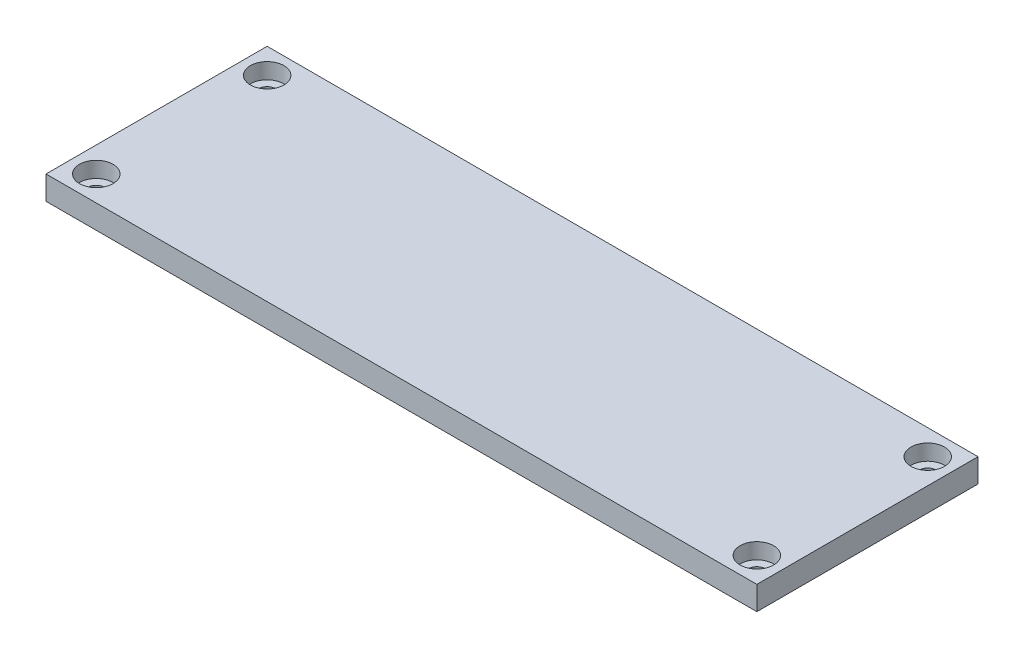
ISO-10303-21;
HEADER;
FILE_DESCRIPTION(('STEP AP214'),'2;1');
FILE_NAME('part.step','',(''),(''),'','','');
FILE_SCHEMA(('AUTOMOTIVE_DESIGN { 1 0 10303 214 1 1 1 1 }'));
ENDSEC;
DATA;
#1=APPLICATION_CONTEXT('core data for automotive mechanical design processes');
#2=APPLICATION_PROTOCOL_DEFINITION('international standard','automotive_design',2000,#1);
#3=PRODUCT_CONTEXT('',#1,'mechanical');
#4=PRODUCT('Part','Part','',(#3));
#5=PRODUCT_RELATED_PRODUCT_CATEGORY('part','',(#4));
#6=PRODUCT_DEFINITION_FORMATION('','',#4);
#7=PRODUCT_DEFINITION_CONTEXT('part definition',#1,'design');
#8=PRODUCT_DEFINITION('design','',#6,#7);
#9=PRODUCT_DEFINITION_SHAPE('','',#8);
#10=(LENGTH_UNIT() NAMED_UNIT(*) SI_UNIT(.MILLI.,.METRE.));
#11=(NAMED_UNIT(*) PLANE_ANGLE_UNIT() SI_UNIT($,.RADIAN.));
#12=(NAMED_UNIT(*) SI_UNIT($,.STERADIAN.) SOLID_ANGLE_UNIT());
#13=UNCERTAINTY_MEASURE_WITH_UNIT(LENGTH_MEASURE(1.E-05),#10,'distance_accuracy_value','');
#14=(GEOMETRIC_REPRESENTATION_CONTEXT(3) GLOBAL_UNCERTAINTY_ASSIGNED_CONTEXT((#13)) GLOBAL_UNIT_ASSIGNED_CONTEXT((#10,
#11,#12)) REPRESENTATION_CONTEXT('',''));
#15=CARTESIAN_POINT('',(0.,0.,0.));
#16=DIRECTION('',(0.,0.,1.));
#17=DIRECTION('',(1.,0.,0.));
#18=AXIS2_PLACEMENT_3D('',#15,#16,#17);
#19=CARTESIAN_POINT('',(-34.7741935483871,3.,8.01612903225806));
#20=DIRECTION('',(1.,0.,0.));
#21=DIRECTION('',(0.,0.,-1.));
#22=AXIS2_PLACEMENT_3D('',#19,#20,#21);
#23=PLANE('',#22);
#24=DIRECTION('',(0.,0.,1.));
#25=VECTOR('',#24,1.);
#26=CARTESIAN_POINT('',(-34.7741935483871,0.,8.01612903225806));
#27=LINE('',#26,#25);
#28=CARTESIAN_POINT('',(-34.7741935483871,0.,-19.9838709677419));
#29=VERTEX_POINT('',#28);
#30=CARTESIAN_POINT('',(-34.7741935483871,0.,8.01612903225806));
#31=VERTEX_POINT('',#30);
#32=EDGE_CURVE('E107',#29,#31,#27,.T.);
#33=ORIENTED_EDGE('',*,*,#32,.T.);
#34=DIRECTION('',(0.,-1.,0.));
#35=VECTOR('',#34,1.);
#36=CARTESIAN_POINT('',(-34.7741935483871,3.,8.01612903225806));
#37=LINE('',#36,#35);
#38=CARTESIAN_POINT('',(-34.7741935483871,3.,8.01612903225806));
#39=VERTEX_POINT('',#38);
#40=EDGE_CURVE('E11',#39,#31,#37,.T.);
#41=ORIENTED_EDGE('',*,*,#40,.F.);
#42=DIRECTION('',(0.,0.,1.));
#43=VECTOR('',#42,1.);
#44=CARTESIAN_POINT('',(-34.7741935483871,3.,8.01612903225806));
#45=LINE('',#44,#43);
#46=CARTESIAN_POINT('',(-34.7741935483871,3.,-19.9838709677419));
#47=VERTEX_POINT('',#46);
#48=EDGE_CURVE('E91',#47,#39,#45,.T.);
#49=ORIENTED_EDGE('',*,*,#48,.F.);
#50=DIRECTION('',(0.,-1.,0.));
#51=VECTOR('',#50,1.);
#52=CARTESIAN_POINT('',(-34.7741935483871,3.,-19.9838709677419));
#53=LINE('',#52,#51);
#54=EDGE_CURVE('E103',#47,#29,#53,.T.);
#55=ORIENTED_EDGE('',*,*,#54,.T.);
#56=EDGE_LOOP('',(#33,#41,#49,#55));
#57=FACE_BOUND('',#56,.T.);
#58=ADVANCED_FACE('F39',(#57),#23,.F.);
#59=CARTESIAN_POINT('',(-34.7741935483871,3.,8.01612903225806));
#60=DIRECTION('',(0.,0.,-1.));
#61=DIRECTION('',(-1.,0.,0.));
#62=AXIS2_PLACEMENT_3D('',#59,#60,#61);
#63=PLANE('',#62);
#64=DIRECTION('',(1.,0.,0.));
#65=VECTOR('',#64,1.);
#66=CARTESIAN_POINT('',(-34.7741935483871,0.,8.01612903225806));
#67=LINE('',#66,#65);
#68=CARTESIAN_POINT('',(55.2258064516129,0.,8.01612903225806));
#69=VERTEX_POINT('',#68);
#70=EDGE_CURVE('E96',#31,#69,#67,.T.);
#71=ORIENTED_EDGE('',*,*,#70,.T.);
#72=DIRECTION('',(0.,-1.,0.));
#73=VECTOR('',#72,1.);
#74=CARTESIAN_POINT('',(55.2258064516129,3.,8.01612903225806));
#75=LINE('',#74,#73);
#76=CARTESIAN_POINT('',(55.2258064516129,3.,8.01612903225806));
#77=VERTEX_POINT('',#76);
#78=EDGE_CURVE('E48',#77,#69,#75,.T.);
#79=ORIENTED_EDGE('',*,*,#78,.F.);
#80=DIRECTION('',(1.,0.,0.));
#81=VECTOR('',#80,1.);
#82=CARTESIAN_POINT('',(-34.7741935483871,3.,8.01612903225806));
#83=LINE('',#82,#81);
#84=EDGE_CURVE('E86',#39,#77,#83,.T.);
#85=ORIENTED_EDGE('',*,*,#84,.F.);
#86=ORIENTED_EDGE('',*,*,#40,.T.);
#87=EDGE_LOOP('',(#71,#79,#85,#86));
#88=FACE_BOUND('',#87,.T.);
#89=ADVANCED_FACE('F95',(#88),#63,.F.);
#90=CARTESIAN_POINT('',(55.2258064516129,3.,8.01612903225806));
#91=DIRECTION('',(-1.,0.,0.));
#92=DIRECTION('',(0.,0.,1.));
#93=AXIS2_PLACEMENT_3D('',#90,#91,#92);
#94=PLANE('',#93);
#95=DIRECTION('',(0.,0.,-1.));
#96=VECTOR('',#95,1.);
#97=CARTESIAN_POINT('',(55.2258064516129,0.,8.01612903225806));
#98=LINE('',#97,#96);
#99=CARTESIAN_POINT('',(55.2258064516129,0.,-19.9838709677419));
#100=VERTEX_POINT('',#99);
#101=EDGE_CURVE('E73',#69,#100,#98,.T.);
#102=ORIENTED_EDGE('',*,*,#101,.T.);
#103=DIRECTION('',(0.,-1.,0.));
#104=VECTOR('',#103,1.);
#105=CARTESIAN_POINT('',(55.2258064516129,3.,-19.9838709677419));
#106=LINE('',#105,#104);
#107=CARTESIAN_POINT('',(55.2258064516129,3.,-19.9838709677419));
#108=VERTEX_POINT('',#107);
#109=EDGE_CURVE('E98',#108,#100,#106,.T.);
#110=ORIENTED_EDGE('',*,*,#109,.F.);
#111=DIRECTION('',(0.,0.,-1.));
#112=VECTOR('',#111,1.);
#113=CARTESIAN_POINT('',(55.2258064516129,3.,8.01612903225806));
#114=LINE('',#113,#112);
#115=EDGE_CURVE('E89',#77,#108,#114,.T.);
#116=ORIENTED_EDGE('',*,*,#115,.F.);
#117=ORIENTED_EDGE('',*,*,#78,.T.);
#118=EDGE_LOOP('',(#102,#110,#116,#117));
#119=FACE_BOUND('',#118,.T.);
#120=ADVANCED_FACE('F99',(#119),#94,.F.);
#121=CARTESIAN_POINT('',(-34.7741935483871,3.,-19.9838709677419));
#122=DIRECTION('',(0.,0.,1.));
#123=DIRECTION('',(1.,0.,0.));
#124=AXIS2_PLACEMENT_3D('',#121,#122,#123);
#125=PLANE('',#124);
#126=DIRECTION('',(-1.,0.,0.));
#127=VECTOR('',#126,1.);
#128=CARTESIAN_POINT('',(-34.7741935483871,0.,-19.9838709677419));
#129=LINE('',#128,#127);
#130=EDGE_CURVE('E79',#100,#29,#129,.T.);
#131=ORIENTED_EDGE('',*,*,#130,.T.);
#132=ORIENTED_EDGE('',*,*,#54,.F.);
#133=DIRECTION('',(-1.,0.,0.));
#134=VECTOR('',#133,1.);
#135=CARTESIAN_POINT('',(-34.7741935483871,3.,-19.9838709677419));
#136=LINE('',#135,#134);
#137=EDGE_CURVE('E56',#108,#47,#136,.T.);
#138=ORIENTED_EDGE('',*,*,#137,.F.);
#139=ORIENTED_EDGE('',*,*,#109,.T.);
#140=EDGE_LOOP('',(#131,#132,#138,#139));
#141=FACE_BOUND('',#140,.T.);
#142=ADVANCED_FACE('F121',(#141),#125,.F.);
#143=CARTESIAN_POINT('',(0.,3.,0.));
#144=DIRECTION('',(0.,-1.,0.));
#145=DIRECTION('',(0.,0.,-1.));
#146=AXIS2_PLACEMENT_3D('',#143,#144,#145);
#147=PLANE('',#146);
#148=CARTESIAN_POINT('',(52.0438259362734,3.,-16.8018904524025));
#149=DIRECTION('',(0.,1.,0.));
#150=DIRECTION('',(0.,0.,-1.));
#151=AXIS2_PLACEMENT_3D('',#148,#149,#150);
#152=CIRCLE('',#151,2.125);
#153=CARTESIAN_POINT('',(52.0438259362734,3.,-18.9268904524025));
#154=VERTEX_POINT('',#153);
#155=EDGE_CURVE('E136',#154,#154,#152,.T.);
#156=ORIENTED_EDGE('',*,*,#155,.F.);
#157=EDGE_LOOP('',(#156));
#158=FACE_BOUND('',#157,.T.);
#159=CARTESIAN_POINT('',(52.0438259362734,3.,4.83414851691859));
#160=DIRECTION('',(0.,1.,0.));
#161=DIRECTION('',(0.,0.,1.));
#162=AXIS2_PLACEMENT_3D('',#159,#160,#161);
#163=CIRCLE('',#162,2.125);
#164=CARTESIAN_POINT('',(52.0438259362734,3.,6.95914851691859));
#165=VERTEX_POINT('',#164);
#166=EDGE_CURVE('E145',#165,#165,#163,.T.);
#167=ORIENTED_EDGE('',*,*,#166,.F.);
#168=EDGE_LOOP('',(#167));
#169=FACE_BOUND('',#168,.T.);
#170=CARTESIAN_POINT('',(-31.5922130330476,3.,4.8341485169186));
#171=DIRECTION('',(0.,1.,0.));
#172=DIRECTION('',(0.,0.,-1.));
#173=AXIS2_PLACEMENT_3D('',#170,#171,#172);
#174=CIRCLE('',#173,2.125);
#175=CARTESIAN_POINT('',(-31.5922130330476,3.,2.7091485169186));
#176=VERTEX_POINT('',#175);
#177=EDGE_CURVE('E153',#176,#176,#174,.T.);
#178=ORIENTED_EDGE('',*,*,#177,.F.);
#179=EDGE_LOOP('',(#178));
#180=FACE_BOUND('',#179,.T.);
#181=CARTESIAN_POINT('',(-31.5922130330476,3.,-16.8018904524025));
#182=DIRECTION('',(0.,1.,0.));
#183=DIRECTION('',(0.,0.,1.));
#184=AXIS2_PLACEMENT_3D('',#181,#182,#183);
#185=CIRCLE('',#184,2.125);
#186=CARTESIAN_POINT('',(-31.5922130330476,3.,-14.6768904524025));
#187=VERTEX_POINT('',#186);
#188=EDGE_CURVE('E128',#187,#187,#185,.T.);
#189=ORIENTED_EDGE('',*,*,#188,.F.);
#190=EDGE_LOOP('',(#189));
#191=FACE_BOUND('',#190,.T.);
#192=ORIENTED_EDGE('',*,*,#48,.T.);
#193=ORIENTED_EDGE('',*,*,#84,.T.);
#194=ORIENTED_EDGE('',*,*,#115,.T.);
#195=ORIENTED_EDGE('',*,*,#137,.T.);
#196=EDGE_LOOP('',(#192,#193,#194,#195));
#197=FACE_BOUND('',#196,.T.);
#198=ADVANCED_FACE('F87',(#158,#169,#180,#191,#197),#147,.F.);
#199=CARTESIAN_POINT('',(0.,0.,0.));
#200=DIRECTION('',(0.,-1.,0.));
#201=DIRECTION('',(0.,0.,-1.));
#202=AXIS2_PLACEMENT_3D('',#199,#200,#201);
#203=PLANE('',#202);
#204=CARTESIAN_POINT('',(52.0438259362734,0.,-16.8018904524025));
#205=DIRECTION('',(0.,-1.,0.));
#206=DIRECTION('',(0.,0.,-1.));
#207=AXIS2_PLACEMENT_3D('',#204,#205,#206);
#208=CIRCLE('',#207,1.075);
#209=CARTESIAN_POINT('',(52.0438259362734,0.,-17.8768904524025));
#210=VERTEX_POINT('',#209);
#211=EDGE_CURVE('E183',#210,#210,#208,.T.);
#212=ORIENTED_EDGE('',*,*,#211,.F.);
#213=EDGE_LOOP('',(#212));
#214=FACE_BOUND('',#213,.T.);
#215=CARTESIAN_POINT('',(52.0438259362734,0.,4.83414851691859));
#216=DIRECTION('',(0.,-1.,0.));
#217=DIRECTION('',(0.,0.,-1.));
#218=AXIS2_PLACEMENT_3D('',#215,#216,#217);
#219=CIRCLE('',#218,1.075);
#220=CARTESIAN_POINT('',(52.0438259362734,0.,3.75914851691859));
#221=VERTEX_POINT('',#220);
#222=EDGE_CURVE('E175',#221,#221,#219,.T.);
#223=ORIENTED_EDGE('',*,*,#222,.F.);
#224=EDGE_LOOP('',(#223));
#225=FACE_BOUND('',#224,.T.);
#226=CARTESIAN_POINT('',(-31.5922130330476,0.,4.8341485169186));
#227=DIRECTION('',(0.,-1.,0.));
#228=DIRECTION('',(0.,0.,-1.));
#229=AXIS2_PLACEMENT_3D('',#226,#227,#228);
#230=CIRCLE('',#229,1.075);
#231=CARTESIAN_POINT('',(-31.5922130330476,0.,3.7591485169186));
#232=VERTEX_POINT('',#231);
#233=EDGE_CURVE('E167',#232,#232,#230,.T.);
#234=ORIENTED_EDGE('',*,*,#233,.F.);
#235=EDGE_LOOP('',(#234));
#236=FACE_BOUND('',#235,.T.);
#237=CARTESIAN_POINT('',(-31.5922130330476,0.,-16.8018904524025));
#238=DIRECTION('',(0.,-1.,0.));
#239=DIRECTION('',(0.,0.,-1.));
#240=AXIS2_PLACEMENT_3D('',#237,#238,#239);
#241=CIRCLE('',#240,1.075);
#242=CARTESIAN_POINT('',(-31.5922130330476,0.,-17.8768904524025));
#243=VERTEX_POINT('',#242);
#244=EDGE_CURVE('E141',#243,#243,#241,.T.);
#245=ORIENTED_EDGE('',*,*,#244,.F.);
#246=EDGE_LOOP('',(#245));
#247=FACE_BOUND('',#246,.T.);
#248=ORIENTED_EDGE('',*,*,#32,.F.);
#249=ORIENTED_EDGE('',*,*,#130,.F.);
#250=ORIENTED_EDGE('',*,*,#101,.F.);
#251=ORIENTED_EDGE('',*,*,#70,.F.);
#252=EDGE_LOOP('',(#248,#249,#250,#251));
#253=FACE_BOUND('',#252,.T.);
#254=ADVANCED_FACE('F124',(#214,#225,#236,#247,#253),#203,.T.);
#255=CARTESIAN_POINT('',(-31.5922130330476,1.,-16.8018904524025));
#256=DIRECTION('',(0.,1.,0.));
#257=DIRECTION('',(0.,0.,1.));
#258=AXIS2_PLACEMENT_3D('',#255,#256,#257);
#259=CYLINDRICAL_SURFACE('',#258,2.125);
#260=CARTESIAN_POINT('',(-31.5922130330476,1.,-16.8018904524025));
#261=DIRECTION('',(0.,1.,0.));
#262=DIRECTION('',(0.,0.,1.));
#263=AXIS2_PLACEMENT_3D('',#260,#261,#262);
#264=CIRCLE('',#263,2.125);
#265=CARTESIAN_POINT('',(-31.5922130330476,1.,-14.6768904524025));
#266=VERTEX_POINT('',#265);
#267=EDGE_CURVE('E111',#266,#266,#264,.T.);
#268=ORIENTED_EDGE('',*,*,#267,.F.);
#269=EDGE_LOOP('',(#268));
#270=FACE_BOUND('',#269,.T.);
#271=ORIENTED_EDGE('',*,*,#188,.T.);
#272=EDGE_LOOP('',(#271));
#273=FACE_BOUND('',#272,.T.);
#274=ADVANCED_FACE('F223',(#270,#273),#259,.F.);
#275=CARTESIAN_POINT('',(-31.5922130330476,1.,-16.8018904524025));
#276=DIRECTION('',(0.,1.,0.));
#277=DIRECTION('',(0.,0.,1.));
#278=AXIS2_PLACEMENT_3D('',#275,#276,#277);
#279=PLANE('',#278);
#280=CARTESIAN_POINT('',(-31.5922130330476,1.,-16.8018904524025));
#281=DIRECTION('',(0.,1.,0.));
#282=DIRECTION('',(0.,0.,1.));
#283=AXIS2_PLACEMENT_3D('',#280,#281,#282);
#284=CIRCLE('',#283,1.075);
#285=CARTESIAN_POINT('',(-31.5922130330476,1.,-15.7268904524025));
#286=VERTEX_POINT('',#285);
#287=EDGE_CURVE('E163',#286,#286,#284,.T.);
#288=ORIENTED_EDGE('',*,*,#287,.F.);
#289=EDGE_LOOP('',(#288));
#290=FACE_BOUND('',#289,.T.);
#291=ORIENTED_EDGE('',*,*,#267,.T.);
#292=EDGE_LOOP('',(#291));
#293=FACE_BOUND('',#292,.T.);
#294=ADVANCED_FACE('F230',(#290,#293),#279,.T.);
#295=CARTESIAN_POINT('',(-31.5922130330476,1.,4.8341485169186));
#296=DIRECTION('',(0.,1.,0.));
#297=DIRECTION('',(0.,0.,1.));
#298=AXIS2_PLACEMENT_3D('',#295,#296,#297);
#299=CYLINDRICAL_SURFACE('',#298,2.125);
#300=CARTESIAN_POINT('',(-31.5922130330476,1.,4.8341485169186));
#301=DIRECTION('',(0.,1.,0.));
#302=DIRECTION('',(0.,0.,-1.));
#303=AXIS2_PLACEMENT_3D('',#300,#301,#302);
#304=CIRCLE('',#303,2.125);
#305=CARTESIAN_POINT('',(-31.5922130330476,1.,2.7091485169186));
#306=VERTEX_POINT('',#305);
#307=EDGE_CURVE('E132',#306,#306,#304,.T.);
#308=ORIENTED_EDGE('',*,*,#307,.F.);
#309=EDGE_LOOP('',(#308));
#310=FACE_BOUND('',#309,.T.);
#311=ORIENTED_EDGE('',*,*,#177,.T.);
#312=EDGE_LOOP('',(#311));
#313=FACE_BOUND('',#312,.T.);
#314=ADVANCED_FACE('F234',(#310,#313),#299,.F.);
#315=CARTESIAN_POINT('',(-31.5922130330476,1.,4.8341485169186));
#316=DIRECTION('',(0.,-1.,0.));
#317=DIRECTION('',(0.,0.,-1.));
#318=AXIS2_PLACEMENT_3D('',#315,#316,#317);
#319=PLANE('',#318);
#320=CARTESIAN_POINT('',(-31.5922130330476,1.,4.8341485169186));
#321=DIRECTION('',(0.,-1.,0.));
#322=DIRECTION('',(0.,0.,-1.));
#323=AXIS2_PLACEMENT_3D('',#320,#321,#322);
#324=CIRCLE('',#323,1.075);
#325=CARTESIAN_POINT('',(-31.5922130330476,1.,3.7591485169186));
#326=VERTEX_POINT('',#325);
#327=EDGE_CURVE('E171',#326,#326,#324,.T.);
#328=ORIENTED_EDGE('',*,*,#327,.T.);
#329=EDGE_LOOP('',(#328));
#330=FACE_BOUND('',#329,.T.);
#331=ORIENTED_EDGE('',*,*,#307,.T.);
#332=EDGE_LOOP('',(#331));
#333=FACE_BOUND('',#332,.T.);
#334=ADVANCED_FACE('F243',(#330,#333),#319,.F.);
#335=CARTESIAN_POINT('',(52.0438259362734,1.,4.83414851691859));
#336=DIRECTION('',(0.,1.,0.));
#337=DIRECTION('',(0.,0.,1.));
#338=AXIS2_PLACEMENT_3D('',#335,#336,#337);
#339=CYLINDRICAL_SURFACE('',#338,2.125);
#340=CARTESIAN_POINT('',(52.0438259362734,1.,4.83414851691859));
#341=DIRECTION('',(0.,1.,0.));
#342=DIRECTION('',(0.,0.,1.));
#343=AXIS2_PLACEMENT_3D('',#340,#341,#342);
#344=CIRCLE('',#343,2.125);
#345=CARTESIAN_POINT('',(52.0438259362734,1.,6.95914851691859));
#346=VERTEX_POINT('',#345);
#347=EDGE_CURVE('E149',#346,#346,#344,.T.);
#348=ORIENTED_EDGE('',*,*,#347,.F.);
#349=EDGE_LOOP('',(#348));
#350=FACE_BOUND('',#349,.T.);
#351=ORIENTED_EDGE('',*,*,#166,.T.);
#352=EDGE_LOOP('',(#351));
#353=FACE_BOUND('',#352,.T.);
#354=ADVANCED_FACE('F240',(#350,#353),#339,.F.);
#355=CARTESIAN_POINT('',(52.0438259362734,1.,4.83414851691859));
#356=DIRECTION('',(0.,1.,0.));
#357=DIRECTION('',(0.,0.,1.));
#358=AXIS2_PLACEMENT_3D('',#355,#356,#357);
#359=PLANE('',#358);
#360=CARTESIAN_POINT('',(52.0438259362734,1.,4.83414851691859));
#361=DIRECTION('',(0.,1.,0.));
#362=DIRECTION('',(0.,0.,1.));
#363=AXIS2_PLACEMENT_3D('',#360,#361,#362);
#364=CIRCLE('',#363,1.075);
#365=CARTESIAN_POINT('',(52.0438259362734,1.,5.90914851691859));
#366=VERTEX_POINT('',#365);
#367=EDGE_CURVE('E179',#366,#366,#364,.T.);
#368=ORIENTED_EDGE('',*,*,#367,.F.);
#369=EDGE_LOOP('',(#368));
#370=FACE_BOUND('',#369,.T.);
#371=ORIENTED_EDGE('',*,*,#347,.T.);
#372=EDGE_LOOP('',(#371));
#373=FACE_BOUND('',#372,.T.);
#374=ADVANCED_FACE('F237',(#370,#373),#359,.T.);
#375=CARTESIAN_POINT('',(52.0438259362734,1.,-16.8018904524025));
#376=DIRECTION('',(0.,1.,0.));
#377=DIRECTION('',(0.,0.,1.));
#378=AXIS2_PLACEMENT_3D('',#375,#376,#377);
#379=CYLINDRICAL_SURFACE('',#378,2.125);
#380=CARTESIAN_POINT('',(52.0438259362734,1.,-16.8018904524025));
#381=DIRECTION('',(0.,1.,0.));
#382=DIRECTION('',(0.,0.,-1.));
#383=AXIS2_PLACEMENT_3D('',#380,#381,#382);
#384=CIRCLE('',#383,2.125);
#385=CARTESIAN_POINT('',(52.0438259362734,1.,-18.9268904524025));
#386=VERTEX_POINT('',#385);
#387=EDGE_CURVE('E140',#386,#386,#384,.T.);
#388=ORIENTED_EDGE('',*,*,#387,.F.);
#389=EDGE_LOOP('',(#388));
#390=FACE_BOUND('',#389,.T.);
#391=ORIENTED_EDGE('',*,*,#155,.T.);
#392=EDGE_LOOP('',(#391));
#393=FACE_BOUND('',#392,.T.);
#394=ADVANCED_FACE('F207',(#390,#393),#379,.F.);
#395=CARTESIAN_POINT('',(52.0438259362734,1.,-16.8018904524025));
#396=DIRECTION('',(0.,-1.,0.));
#397=DIRECTION('',(0.,0.,-1.));
#398=AXIS2_PLACEMENT_3D('',#395,#396,#397);
#399=PLANE('',#398);
#400=CARTESIAN_POINT('',(52.0438259362734,1.,-16.8018904524025));
#401=DIRECTION('',(0.,-1.,0.));
#402=DIRECTION('',(0.,0.,-1.));
#403=AXIS2_PLACEMENT_3D('',#400,#401,#402);
#404=CIRCLE('',#403,1.075);
#405=CARTESIAN_POINT('',(52.0438259362734,1.,-17.8768904524025));
#406=VERTEX_POINT('',#405);
#407=EDGE_CURVE('E187',#406,#406,#404,.T.);
#408=ORIENTED_EDGE('',*,*,#407,.T.);
#409=EDGE_LOOP('',(#408));
#410=FACE_BOUND('',#409,.T.);
#411=ORIENTED_EDGE('',*,*,#387,.T.);
#412=EDGE_LOOP('',(#411));
#413=FACE_BOUND('',#412,.T.);
#414=ADVANCED_FACE('F192',(#410,#413),#399,.F.);
#415=CARTESIAN_POINT('',(52.0438259362734,-1.,-16.8018904524025));
#416=DIRECTION('',(0.,1.,0.));
#417=DIRECTION('',(0.,0.,1.));
#418=AXIS2_PLACEMENT_3D('',#415,#416,#417);
#419=CYLINDRICAL_SURFACE('',#418,1.075);
#420=ORIENTED_EDGE('',*,*,#211,.T.);
#421=EDGE_LOOP('',(#420));
#422=FACE_BOUND('',#421,.T.);
#423=ORIENTED_EDGE('',*,*,#407,.F.);
#424=EDGE_LOOP('',(#423));
#425=FACE_BOUND('',#424,.T.);
#426=ADVANCED_FACE('F195',(#422,#425),#419,.F.);
#427=CARTESIAN_POINT('',(52.0438259362734,-1.,4.83414851691859));
#428=DIRECTION('',(0.,1.,0.));
#429=DIRECTION('',(0.,0.,1.));
#430=AXIS2_PLACEMENT_3D('',#427,#428,#429);
#431=CYLINDRICAL_SURFACE('',#430,1.075);
#432=ORIENTED_EDGE('',*,*,#222,.T.);
#433=EDGE_LOOP('',(#432));
#434=FACE_BOUND('',#433,.T.);
#435=ORIENTED_EDGE('',*,*,#367,.T.);
#436=EDGE_LOOP('',(#435));
#437=FACE_BOUND('',#436,.T.);
#438=ADVANCED_FACE('F197',(#434,#437),#431,.F.);
#439=CARTESIAN_POINT('',(-31.5922130330476,-1.,4.8341485169186));
#440=DIRECTION('',(0.,1.,0.));
#441=DIRECTION('',(0.,0.,1.));
#442=AXIS2_PLACEMENT_3D('',#439,#440,#441);
#443=CYLINDRICAL_SURFACE('',#442,1.075);
#444=ORIENTED_EDGE('',*,*,#233,.T.);
#445=EDGE_LOOP('',(#444));
#446=FACE_BOUND('',#445,.T.);
#447=ORIENTED_EDGE('',*,*,#327,.F.);
#448=EDGE_LOOP('',(#447));
#449=FACE_BOUND('',#448,.T.);
#450=ADVANCED_FACE('F204',(#446,#449),#443,.F.);
#451=CARTESIAN_POINT('',(-31.5922130330476,-1.,-16.8018904524025));
#452=DIRECTION('',(0.,1.,0.));
#453=DIRECTION('',(0.,0.,1.));
#454=AXIS2_PLACEMENT_3D('',#451,#452,#453);
#455=CYLINDRICAL_SURFACE('',#454,1.075);
#456=ORIENTED_EDGE('',*,*,#244,.T.);
#457=EDGE_LOOP('',(#456));
#458=FACE_BOUND('',#457,.T.);
#459=ORIENTED_EDGE('',*,*,#287,.T.);
#460=EDGE_LOOP('',(#459));
#461=FACE_BOUND('',#460,.T.);
#462=ADVANCED_FACE('F253',(#458,#461),#455,.F.);
#463=CLOSED_SHELL('',(#58,#89,#120,#142,#198,#254,#274,#294,#314,#334,#354,#374,#394,#414,#426,
#438,#450,#462));
#464=MANIFOLD_SOLID_BREP('B2',#463);
#465=ADVANCED_BREP_SHAPE_REPRESENTATION('',(#18,#464),#14);
#466=SHAPE_DEFINITION_REPRESENTATION(#9,#465);
ENDSEC;
END-ISO-10303-21;
